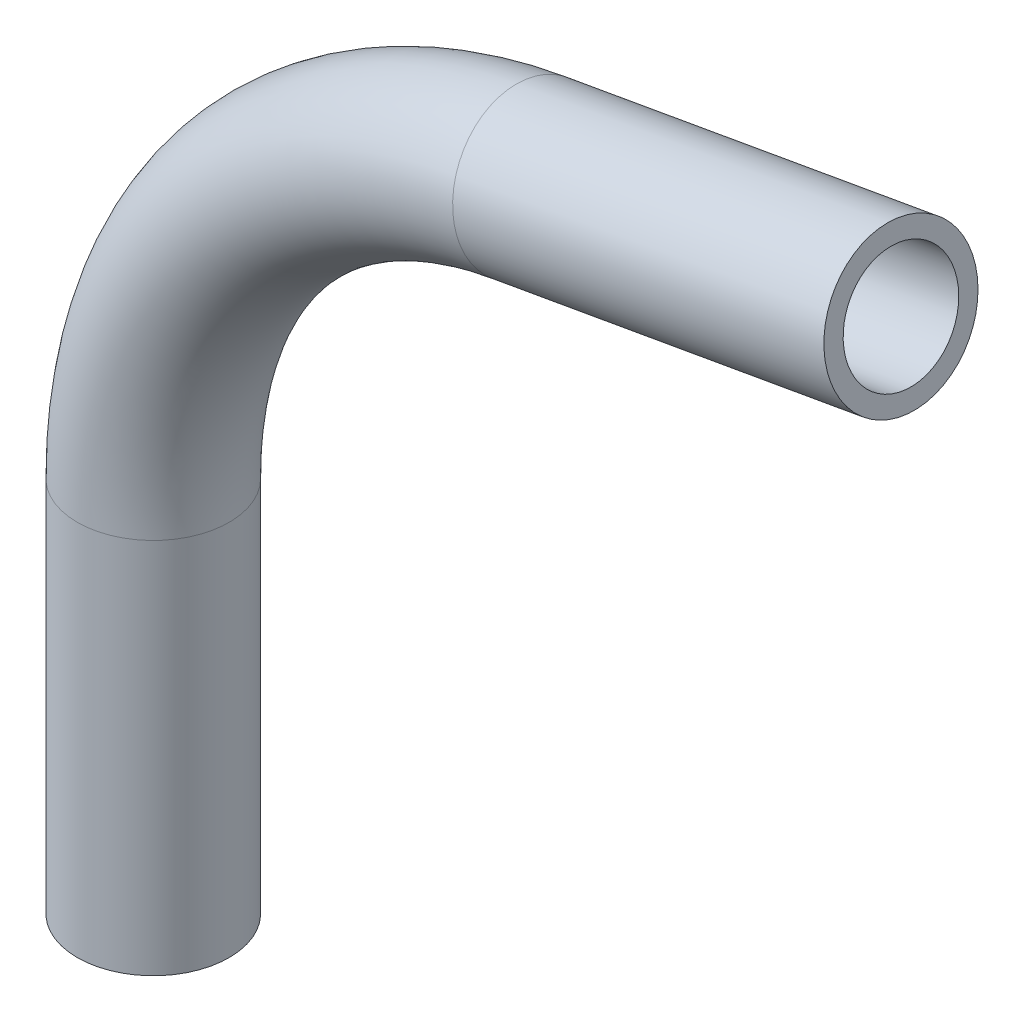
ISO-10303-21;
HEADER;
FILE_DESCRIPTION(('STEP AP214'),'2;1');
FILE_NAME('part.step','',(''),(''),'','','');
FILE_SCHEMA(('AUTOMOTIVE_DESIGN { 1 0 10303 214 1 1 1 1 }'));
ENDSEC;
DATA;
#1=APPLICATION_CONTEXT('core data for automotive mechanical design processes');
#2=APPLICATION_PROTOCOL_DEFINITION('international standard','automotive_design',2000,#1);
#3=PRODUCT_CONTEXT('',#1,'mechanical');
#4=PRODUCT('Part','Part','',(#3));
#5=PRODUCT_RELATED_PRODUCT_CATEGORY('part','',(#4));
#6=PRODUCT_DEFINITION_FORMATION('','',#4);
#7=PRODUCT_DEFINITION_CONTEXT('part definition',#1,'design');
#8=PRODUCT_DEFINITION('design','',#6,#7);
#9=PRODUCT_DEFINITION_SHAPE('','',#8);
#10=(LENGTH_UNIT() NAMED_UNIT(*) SI_UNIT(.MILLI.,.METRE.));
#11=(NAMED_UNIT(*) PLANE_ANGLE_UNIT() SI_UNIT($,.RADIAN.));
#12=(NAMED_UNIT(*) SI_UNIT($,.STERADIAN.) SOLID_ANGLE_UNIT());
#13=UNCERTAINTY_MEASURE_WITH_UNIT(LENGTH_MEASURE(1.E-05),#10,'distance_accuracy_value','');
#14=(GEOMETRIC_REPRESENTATION_CONTEXT(3) GLOBAL_UNCERTAINTY_ASSIGNED_CONTEXT((#13)) GLOBAL_UNIT_ASSIGNED_CONTEXT((#10,
#11,#12)) REPRESENTATION_CONTEXT('',''));
#15=CARTESIAN_POINT('',(0.,0.,0.));
#16=DIRECTION('',(0.,0.,1.));
#17=DIRECTION('',(1.,0.,0.));
#18=AXIS2_PLACEMENT_3D('',#15,#16,#17);
#19=CARTESIAN_POINT('',(0.,0.,0.));
#20=DIRECTION('',(0.,1.,0.));
#21=DIRECTION('',(0.,0.,1.));
#22=AXIS2_PLACEMENT_3D('',#19,#20,#21);
#23=CYLINDRICAL_SURFACE('',#22,4.);
#24=CARTESIAN_POINT('',(0.,19.8616088517452,0.));
#25=DIRECTION('',(0.,1.,0.));
#26=DIRECTION('',(0.,0.,1.));
#27=AXIS2_PLACEMENT_3D('',#24,#25,#26);
#28=CIRCLE('',#27,4.);
#29=CARTESIAN_POINT('',(-4.,19.8616088517452,0.));
#30=VERTEX_POINT('',#29);
#31=EDGE_CURVE('E78',#30,#30,#28,.T.);
#32=ORIENTED_EDGE('',*,*,#31,.F.);
#33=EDGE_LOOP('',(#32));
#34=FACE_BOUND('',#33,.T.);
#35=CARTESIAN_POINT('',(0.,0.,0.));
#36=DIRECTION('',(0.,1.,0.));
#37=DIRECTION('',(0.,0.,1.));
#38=AXIS2_PLACEMENT_3D('',#35,#36,#37);
#39=CIRCLE('',#38,4.);
#40=CARTESIAN_POINT('',(0.,0.,4.));
#41=VERTEX_POINT('',#40);
#42=EDGE_CURVE('E47',#41,#41,#39,.T.);
#43=ORIENTED_EDGE('',*,*,#42,.T.);
#44=EDGE_LOOP('',(#43));
#45=FACE_BOUND('',#44,.T.);
#46=ADVANCED_FACE('F32',(#34,#45),#23,.T.);
#47=CARTESIAN_POINT('',(24.,19.8616088517452,0.));
#48=DIRECTION('',(0.,0.,-1.));
#49=DIRECTION('',(-1.,0.,0.));
#50=AXIS2_PLACEMENT_3D('',#47,#48,#49);
#51=TOROIDAL_SURFACE('',#50,24.,4.);
#52=CARTESIAN_POINT('',(19.8324437359937,43.4969949240382,0.));
#53=DIRECTION('',(0.984807753012209,0.173648177666927,0.));
#54=DIRECTION('',(0.,0.,1.));
#55=AXIS2_PLACEMENT_3D('',#52,#53,#54);
#56=CIRCLE('',#55,4.);
#57=CARTESIAN_POINT('',(19.137851025326,47.4362259360871,0.));
#58=VERTEX_POINT('',#57);
#59=EDGE_CURVE('E36',#58,#58,#56,.T.);
#60=CARTESIAN_POINT('',(24.,19.8616088517452,0.));
#61=DIRECTION('',(0.,0.,-1.));
#62=DIRECTION('',(-1.,0.,0.));
#63=AXIS2_PLACEMENT_3D('',#60,#61,#62);
#64=CIRCLE('',#63,28.);
#65=EDGE_CURVE('',#30,#58,#64,.T.);
#66=ORIENTED_EDGE('',*,*,#31,.T.);
#67=ORIENTED_EDGE('',*,*,#59,.F.);
#68=ORIENTED_EDGE('',*,*,#65,.T.);
#69=ORIENTED_EDGE('',*,*,#65,.F.);
#70=EDGE_LOOP('',(#66,#68,#67,#69));
#71=FACE_BOUND('',#70,.T.);
#72=ADVANCED_FACE('F86',(#71),#51,.T.);
#73=CARTESIAN_POINT('',(19.8324437359937,43.4969949240382,0.));
#74=DIRECTION('',(0.984807753012209,0.173648177666928,0.));
#75=DIRECTION('',(-0.173648177666928,0.984807753012208,0.));
#76=AXIS2_PLACEMENT_3D('',#73,#74,#75);
#77=CYLINDRICAL_SURFACE('',#76,4.);
#78=CARTESIAN_POINT('',(39.3923101204883,46.9459271066771,0.));
#79=DIRECTION('',(0.984807753012209,0.173648177666928,0.));
#80=DIRECTION('',(0.,0.,1.));
#81=AXIS2_PLACEMENT_3D('',#78,#79,#80);
#82=CIRCLE('',#81,4.);
#83=CARTESIAN_POINT('',(39.3923101204883,46.9459271066771,4.));
#84=VERTEX_POINT('',#83);
#85=EDGE_CURVE('E52',#84,#84,#82,.T.);
#86=ORIENTED_EDGE('',*,*,#85,.F.);
#87=EDGE_LOOP('',(#86));
#88=FACE_BOUND('',#87,.T.);
#89=ORIENTED_EDGE('',*,*,#59,.T.);
#90=EDGE_LOOP('',(#89));
#91=FACE_BOUND('',#90,.T.);
#92=ADVANCED_FACE('F34',(#88,#91),#77,.T.);
#93=CARTESIAN_POINT('',(0.,0.,0.));
#94=DIRECTION('',(0.,1.,0.));
#95=DIRECTION('',(0.,0.,1.));
#96=AXIS2_PLACEMENT_3D('',#93,#94,#95);
#97=PLANE('',#96);
#98=CARTESIAN_POINT('',(0.,0.,0.));
#99=DIRECTION('',(0.,1.,0.));
#100=DIRECTION('',(0.,0.,1.));
#101=AXIS2_PLACEMENT_3D('',#98,#99,#100);
#102=CIRCLE('',#101,3.);
#103=CARTESIAN_POINT('',(0.,0.,3.));
#104=VERTEX_POINT('',#103);
#105=EDGE_CURVE('E73',#104,#104,#102,.F.);
#106=ORIENTED_EDGE('',*,*,#105,.F.);
#107=EDGE_LOOP('',(#106));
#108=FACE_BOUND('',#107,.T.);
#109=ORIENTED_EDGE('',*,*,#42,.F.);
#110=EDGE_LOOP('',(#109));
#111=FACE_BOUND('',#110,.T.);
#112=ADVANCED_FACE('F92',(#108,#111),#97,.F.);
#113=CARTESIAN_POINT('',(39.3923101204883,46.9459271066771,0.));
#114=DIRECTION('',(0.984807753012209,0.173648177666928,0.));
#115=DIRECTION('',(0.,0.,1.));
#116=AXIS2_PLACEMENT_3D('',#113,#114,#115);
#117=PLANE('',#116);
#118=CARTESIAN_POINT('',(39.3923101204883,46.9459271066771,0.));
#119=DIRECTION('',(0.984807753012209,0.173648177666928,0.));
#120=DIRECTION('',(0.,0.,1.));
#121=AXIS2_PLACEMENT_3D('',#118,#119,#120);
#122=CIRCLE('',#121,3.);
#123=CARTESIAN_POINT('',(39.3923101204883,46.9459271066771,3.));
#124=VERTEX_POINT('',#123);
#125=EDGE_CURVE('E11',#124,#124,#122,.F.);
#126=ORIENTED_EDGE('',*,*,#125,.T.);
#127=EDGE_LOOP('',(#126));
#128=FACE_BOUND('',#127,.T.);
#129=ORIENTED_EDGE('',*,*,#85,.T.);
#130=EDGE_LOOP('',(#129));
#131=FACE_BOUND('',#130,.T.);
#132=ADVANCED_FACE('F59',(#128,#131),#117,.T.);
#133=CARTESIAN_POINT('',(0.,0.,0.));
#134=DIRECTION('',(0.,1.,0.));
#135=DIRECTION('',(0.,0.,1.));
#136=AXIS2_PLACEMENT_3D('',#133,#134,#135);
#137=CYLINDRICAL_SURFACE('',#136,3.);
#138=CARTESIAN_POINT('',(0.,19.8616088517452,0.));
#139=DIRECTION('',(0.,1.,0.));
#140=DIRECTION('',(0.,0.,1.));
#141=AXIS2_PLACEMENT_3D('',#138,#139,#140);
#142=CIRCLE('',#141,3.);
#143=CARTESIAN_POINT('',(-3.,19.8616088517452,0.));
#144=VERTEX_POINT('',#143);
#145=EDGE_CURVE('E70',#144,#144,#142,.F.);
#146=ORIENTED_EDGE('',*,*,#145,.F.);
#147=EDGE_LOOP('',(#146));
#148=FACE_BOUND('',#147,.T.);
#149=ORIENTED_EDGE('',*,*,#105,.T.);
#150=EDGE_LOOP('',(#149));
#151=FACE_BOUND('',#150,.T.);
#152=ADVANCED_FACE('F100',(#148,#151),#137,.F.);
#153=CARTESIAN_POINT('',(24.,19.8616088517452,0.));
#154=DIRECTION('',(0.,0.,-1.));
#155=DIRECTION('',(-1.,0.,0.));
#156=AXIS2_PLACEMENT_3D('',#153,#154,#155);
#157=TOROIDAL_SURFACE('',#156,24.,3.);
#158=CARTESIAN_POINT('',(19.8324437359937,43.4969949240382,0.));
#159=DIRECTION('',(0.984807753012209,0.173648177666927,0.));
#160=DIRECTION('',(0.,0.,1.));
#161=AXIS2_PLACEMENT_3D('',#158,#159,#160);
#162=CIRCLE('',#161,3.);
#163=CARTESIAN_POINT('',(19.311499202993,46.4514181830748,0.));
#164=VERTEX_POINT('',#163);
#165=EDGE_CURVE('E41',#164,#164,#162,.F.);
#166=CARTESIAN_POINT('',(24.,19.8616088517452,0.));
#167=DIRECTION('',(0.,0.,-1.));
#168=DIRECTION('',(-1.,0.,0.));
#169=AXIS2_PLACEMENT_3D('',#166,#167,#168);
#170=CIRCLE('',#169,27.);
#171=EDGE_CURVE('',#144,#164,#170,.T.);
#172=ORIENTED_EDGE('',*,*,#145,.T.);
#173=ORIENTED_EDGE('',*,*,#165,.F.);
#174=ORIENTED_EDGE('',*,*,#171,.T.);
#175=ORIENTED_EDGE('',*,*,#171,.F.);
#176=EDGE_LOOP('',(#172,#174,#173,#175));
#177=FACE_BOUND('',#176,.T.);
#178=ADVANCED_FACE('F65',(#177),#157,.F.);
#179=CARTESIAN_POINT('',(19.8324437359937,43.4969949240382,0.));
#180=DIRECTION('',(0.984807753012209,0.173648177666928,0.));
#181=DIRECTION('',(-0.173648177666928,0.984807753012208,0.));
#182=AXIS2_PLACEMENT_3D('',#179,#180,#181);
#183=CYLINDRICAL_SURFACE('',#182,3.);
#184=ORIENTED_EDGE('',*,*,#125,.F.);
#185=EDGE_LOOP('',(#184));
#186=FACE_BOUND('',#185,.T.);
#187=ORIENTED_EDGE('',*,*,#165,.T.);
#188=EDGE_LOOP('',(#187));
#189=FACE_BOUND('',#188,.T.);
#190=ADVANCED_FACE('F62',(#186,#189),#183,.F.);
#191=CLOSED_SHELL('',(#46,#72,#92,#112,#132,#152,#178,#190));
#192=MANIFOLD_SOLID_BREP('B2',#191);
#193=ADVANCED_BREP_SHAPE_REPRESENTATION('',(#18,#192),#14);
#194=SHAPE_DEFINITION_REPRESENTATION(#9,#193);
ENDSEC;
END-ISO-10303-21;
